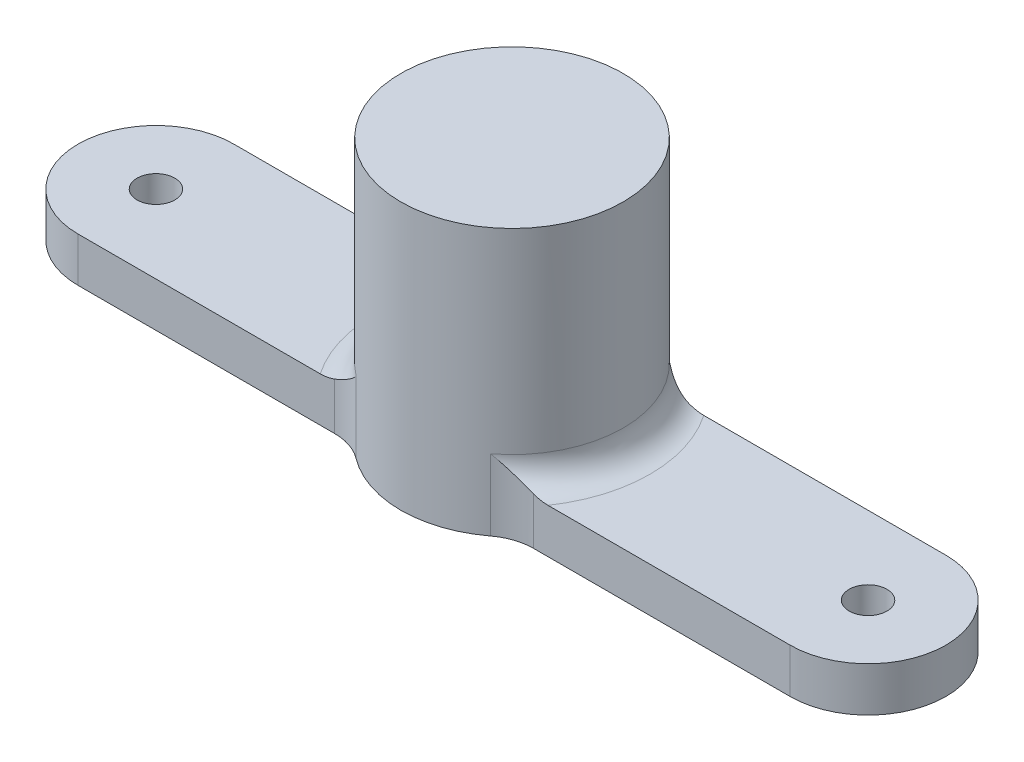
ISO-10303-21;
HEADER;
FILE_DESCRIPTION(('STEP AP214'),'2;1');
FILE_NAME('part.step','',(''),(''),'','','');
FILE_SCHEMA(('AUTOMOTIVE_DESIGN { 1 0 10303 214 1 1 1 1 }'));
ENDSEC;
DATA;
#1=APPLICATION_CONTEXT('core data for automotive mechanical design processes');
#2=APPLICATION_PROTOCOL_DEFINITION('international standard','automotive_design',2000,#1);
#3=PRODUCT_CONTEXT('',#1,'mechanical');
#4=PRODUCT('Part','Part','',(#3));
#5=PRODUCT_RELATED_PRODUCT_CATEGORY('part','',(#4));
#6=PRODUCT_DEFINITION_FORMATION('','',#4);
#7=PRODUCT_DEFINITION_CONTEXT('part definition',#1,'design');
#8=PRODUCT_DEFINITION('design','',#6,#7);
#9=PRODUCT_DEFINITION_SHAPE('','',#8);
#10=(LENGTH_UNIT() NAMED_UNIT(*) SI_UNIT(.MILLI.,.METRE.));
#11=(NAMED_UNIT(*) PLANE_ANGLE_UNIT() SI_UNIT($,.RADIAN.));
#12=(NAMED_UNIT(*) SI_UNIT($,.STERADIAN.) SOLID_ANGLE_UNIT());
#13=UNCERTAINTY_MEASURE_WITH_UNIT(LENGTH_MEASURE(1.E-05),#10,'distance_accuracy_value','');
#14=(GEOMETRIC_REPRESENTATION_CONTEXT(3) GLOBAL_UNCERTAINTY_ASSIGNED_CONTEXT((#13)) GLOBAL_UNIT_ASSIGNED_CONTEXT((#10,
#11,#12)) REPRESENTATION_CONTEXT('',''));
#15=CARTESIAN_POINT('',(0.,0.,0.));
#16=DIRECTION('',(0.,0.,1.));
#17=DIRECTION('',(1.,0.,0.));
#18=AXIS2_PLACEMENT_3D('',#15,#16,#17);
#19=CARTESIAN_POINT('',(-40.,-5.,0.));
#20=DIRECTION('',(0.,-1.,0.));
#21=DIRECTION('',(0.,0.,-1.));
#22=AXIS2_PLACEMENT_3D('',#19,#20,#21);
#23=PLANE('',#22);
#24=CARTESIAN_POINT('',(-40.,-5.,0.));
#25=DIRECTION('',(0.,-1.,0.));
#26=DIRECTION('',(0.,0.,-1.));
#27=AXIS2_PLACEMENT_3D('',#24,#25,#26);
#28=CIRCLE('',#27,8.75);
#29=CARTESIAN_POINT('',(-40.,-5.,8.75));
#30=VERTEX_POINT('',#29);
#31=CARTESIAN_POINT('',(-40.,-5.,-8.75));
#32=VERTEX_POINT('',#31);
#33=EDGE_CURVE('E158',#30,#32,#28,.T.);
#34=ORIENTED_EDGE('',*,*,#33,.T.);
#35=DIRECTION('',(1.,0.,0.));
#36=VECTOR('',#35,1.);
#37=CARTESIAN_POINT('',(-40.,-5.,-8.75));
#38=LINE('',#37,#36);
#39=CARTESIAN_POINT('',(-11.1663557170637,-5.,-8.74999999999999));
#40=VERTEX_POINT('',#39);
#41=EDGE_CURVE('E142',#32,#40,#38,.T.);
#42=ORIENTED_EDGE('',*,*,#41,.T.);
#43=CARTESIAN_POINT('',(-11.1663557170637,-5.,-14.75));
#44=DIRECTION('',(0.,-1.,0.));
#45=DIRECTION('',(0.,0.,-1.));
#46=AXIS2_PLACEMENT_3D('',#43,#44,#45);
#47=CIRCLE('',#46,6.);
#48=CARTESIAN_POINT('',(-7.54483494396193,-5.,-9.96621621621621));
#49=VERTEX_POINT('',#48);
#50=EDGE_CURVE('E273',#40,#49,#47,.F.);
#51=ORIENTED_EDGE('',*,*,#50,.T.);
#52=CARTESIAN_POINT('',(0.,-5.,0.));
#53=DIRECTION('',(0.,-1.,0.));
#54=DIRECTION('',(0.,0.,-1.));
#55=AXIS2_PLACEMENT_3D('',#52,#53,#54);
#56=CIRCLE('',#55,12.5);
#57=CARTESIAN_POINT('',(7.54483494396193,-5.,-9.96621621621621));
#58=VERTEX_POINT('',#57);
#59=EDGE_CURVE('E447',#49,#58,#56,.T.);
#60=ORIENTED_EDGE('',*,*,#59,.T.);
#61=CARTESIAN_POINT('',(11.1663557170637,-5.,-14.75));
#62=DIRECTION('',(0.,-1.,0.));
#63=DIRECTION('',(0.,0.,-1.));
#64=AXIS2_PLACEMENT_3D('',#61,#62,#63);
#65=CIRCLE('',#64,6.);
#66=CARTESIAN_POINT('',(11.1663557170637,-5.,-8.74999999999999));
#67=VERTEX_POINT('',#66);
#68=EDGE_CURVE('E11',#58,#67,#65,.F.);
#69=ORIENTED_EDGE('',*,*,#68,.T.);
#70=CARTESIAN_POINT('',(40.,-5.,-8.74999999999999));
#71=VERTEX_POINT('',#70);
#72=EDGE_CURVE('E155',#67,#71,#38,.T.);
#73=ORIENTED_EDGE('',*,*,#72,.T.);
#74=CARTESIAN_POINT('',(40.,-5.,0.));
#75=DIRECTION('',(0.,-1.,0.));
#76=DIRECTION('',(0.,0.,-1.));
#77=AXIS2_PLACEMENT_3D('',#74,#75,#76);
#78=CIRCLE('',#77,8.75);
#79=CARTESIAN_POINT('',(40.,-5.,8.75000000000001));
#80=VERTEX_POINT('',#79);
#81=EDGE_CURVE('E154',#71,#80,#78,.T.);
#82=ORIENTED_EDGE('',*,*,#81,.T.);
#83=DIRECTION('',(-1.,0.,0.));
#84=VECTOR('',#83,1.);
#85=CARTESIAN_POINT('',(-40.,-5.,8.75));
#86=LINE('',#85,#84);
#87=CARTESIAN_POINT('',(11.1663557170636,-5.,8.75000000000001));
#88=VERTEX_POINT('',#87);
#89=EDGE_CURVE('E326',#80,#88,#86,.T.);
#90=ORIENTED_EDGE('',*,*,#89,.T.);
#91=CARTESIAN_POINT('',(11.1663557170636,-5.,14.75));
#92=DIRECTION('',(0.,-1.,0.));
#93=DIRECTION('',(0.,0.,-1.));
#94=AXIS2_PLACEMENT_3D('',#91,#92,#93);
#95=CIRCLE('',#94,6.);
#96=CARTESIAN_POINT('',(7.54483494396192,-5.,9.96621621621622));
#97=VERTEX_POINT('',#96);
#98=EDGE_CURVE('E240',#88,#97,#95,.F.);
#99=ORIENTED_EDGE('',*,*,#98,.T.);
#100=CARTESIAN_POINT('',(0.,-5.,0.));
#101=DIRECTION('',(0.,-1.,0.));
#102=DIRECTION('',(0.,0.,-1.));
#103=AXIS2_PLACEMENT_3D('',#100,#101,#102);
#104=CIRCLE('',#103,12.5);
#105=CARTESIAN_POINT('',(-7.54483494396192,-5.,9.96621621621622));
#106=VERTEX_POINT('',#105);
#107=EDGE_CURVE('E334',#97,#106,#104,.T.);
#108=ORIENTED_EDGE('',*,*,#107,.T.);
#109=CARTESIAN_POINT('',(-11.1663557170636,-5.,14.75));
#110=DIRECTION('',(0.,-1.,0.));
#111=DIRECTION('',(0.,0.,-1.));
#112=AXIS2_PLACEMENT_3D('',#109,#110,#111);
#113=CIRCLE('',#112,6.);
#114=CARTESIAN_POINT('',(-11.1663557170636,-5.,8.75));
#115=VERTEX_POINT('',#114);
#116=EDGE_CURVE('E263',#106,#115,#113,.F.);
#117=ORIENTED_EDGE('',*,*,#116,.T.);
#118=EDGE_CURVE('E161',#115,#30,#86,.T.);
#119=ORIENTED_EDGE('',*,*,#118,.T.);
#120=EDGE_LOOP('',(#34,#42,#51,#60,#69,#73,#82,#90,#99,#108,#117,#119));
#121=FACE_BOUND('',#120,.T.);
#122=CARTESIAN_POINT('',(-40.,-5.,0.));
#123=DIRECTION('',(0.,-1.,0.));
#124=DIRECTION('',(0.,0.,-1.));
#125=AXIS2_PLACEMENT_3D('',#122,#123,#124);
#126=CIRCLE('',#125,4.15);
#127=CARTESIAN_POINT('',(-40.,-5.,-4.15));
#128=VERTEX_POINT('',#127);
#129=EDGE_CURVE('E435',#128,#128,#126,.T.);
#130=ORIENTED_EDGE('',*,*,#129,.F.);
#131=EDGE_LOOP('',(#130));
#132=FACE_BOUND('',#131,.T.);
#133=CARTESIAN_POINT('',(40.,-5.,0.));
#134=DIRECTION('',(0.,1.,0.));
#135=DIRECTION('',(0.,0.,-1.));
#136=AXIS2_PLACEMENT_3D('',#133,#134,#135);
#137=CIRCLE('',#136,4.15);
#138=CARTESIAN_POINT('',(40.,-5.,-4.15));
#139=VERTEX_POINT('',#138);
#140=EDGE_CURVE('E419',#139,#139,#137,.T.);
#141=ORIENTED_EDGE('',*,*,#140,.T.);
#142=EDGE_LOOP('',(#141));
#143=FACE_BOUND('',#142,.T.);
#144=ADVANCED_FACE('F39',(#121,#132,#143),#23,.T.);
#145=CARTESIAN_POINT('',(40.,-5.,0.));
#146=DIRECTION('',(0.,1.,0.));
#147=DIRECTION('',(0.,0.,1.));
#148=AXIS2_PLACEMENT_3D('',#145,#146,#147);
#149=CYLINDRICAL_SURFACE('',#148,2.125);
#150=CARTESIAN_POINT('',(40.,0.,0.));
#151=DIRECTION('',(0.,-1.,0.));
#152=DIRECTION('',(0.,0.,1.));
#153=AXIS2_PLACEMENT_3D('',#150,#151,#152);
#154=CIRCLE('',#153,2.125);
#155=CARTESIAN_POINT('',(40.,0.,2.125));
#156=VERTEX_POINT('',#155);
#157=EDGE_CURVE('E426',#156,#156,#154,.T.);
#158=ORIENTED_EDGE('',*,*,#157,.F.);
#159=EDGE_LOOP('',(#158));
#160=FACE_BOUND('',#159,.T.);
#161=CARTESIAN_POINT('',(40.,-3.,0.));
#162=DIRECTION('',(0.,1.,0.));
#163=DIRECTION('',(0.,0.,-1.));
#164=AXIS2_PLACEMENT_3D('',#161,#162,#163);
#165=CIRCLE('',#164,2.125);
#166=CARTESIAN_POINT('',(40.,-3.,-2.125));
#167=VERTEX_POINT('',#166);
#168=EDGE_CURVE('E416',#167,#167,#165,.T.);
#169=ORIENTED_EDGE('',*,*,#168,.F.);
#170=EDGE_LOOP('',(#169));
#171=FACE_BOUND('',#170,.T.);
#172=ADVANCED_FACE('F382',(#160,#171),#149,.F.);
#173=CARTESIAN_POINT('',(-40.,-5.,0.));
#174=DIRECTION('',(0.,1.,0.));
#175=DIRECTION('',(0.,0.,1.));
#176=AXIS2_PLACEMENT_3D('',#173,#174,#175);
#177=CYLINDRICAL_SURFACE('',#176,2.125);
#178=CARTESIAN_POINT('',(-40.,0.,0.));
#179=DIRECTION('',(0.,1.,0.));
#180=DIRECTION('',(0.,0.,1.));
#181=AXIS2_PLACEMENT_3D('',#178,#179,#180);
#182=CIRCLE('',#181,2.125);
#183=CARTESIAN_POINT('',(-40.,0.,2.125));
#184=VERTEX_POINT('',#183);
#185=EDGE_CURVE('E440',#184,#184,#182,.T.);
#186=ORIENTED_EDGE('',*,*,#185,.T.);
#187=EDGE_LOOP('',(#186));
#188=FACE_BOUND('',#187,.T.);
#189=CARTESIAN_POINT('',(-40.,-3.,0.));
#190=DIRECTION('',(0.,-1.,0.));
#191=DIRECTION('',(0.,0.,-1.));
#192=AXIS2_PLACEMENT_3D('',#189,#190,#191);
#193=CIRCLE('',#192,2.125);
#194=CARTESIAN_POINT('',(-40.,-3.,-2.125));
#195=VERTEX_POINT('',#194);
#196=EDGE_CURVE('E431',#195,#195,#193,.T.);
#197=ORIENTED_EDGE('',*,*,#196,.T.);
#198=EDGE_LOOP('',(#197));
#199=FACE_BOUND('',#198,.T.);
#200=ADVANCED_FACE('F386',(#188,#199),#177,.F.);
#201=CARTESIAN_POINT('',(-40.,-5.,-8.75));
#202=DIRECTION('',(0.,0.,1.));
#203=DIRECTION('',(1.,0.,0.));
#204=AXIS2_PLACEMENT_3D('',#201,#202,#203);
#205=PLANE('',#204);
#206=ORIENTED_EDGE('',*,*,#72,.F.);
#207=DIRECTION('',(0.,1.,0.));
#208=VECTOR('',#207,1.);
#209=CARTESIAN_POINT('',(11.1663557170637,3.,-8.74999999999999));
#210=LINE('',#209,#208);
#211=CARTESIAN_POINT('',(11.1663557170637,0.302947955184337,-8.74999999999999));
#212=VERTEX_POINT('',#211);
#213=EDGE_CURVE('E241',#67,#212,#210,.T.);
#214=ORIENTED_EDGE('',*,*,#213,.T.);
#215=CARTESIAN_POINT('',(8.92678553567857,3.,-8.74999999999999));
#216=CARTESIAN_POINT('',(8.92675709977544,2.93105381355906,-8.74999999999999));
#217=CARTESIAN_POINT('',(8.93011271661341,2.86212370146082,-8.74999999999999));
#218=CARTESIAN_POINT('',(8.94337216309319,2.72495990012827,-8.74999999999999));
#219=CARTESIAN_POINT('',(8.95326976354844,2.65672561103965,-8.74999999999999));
#220=CARTESIAN_POINT('',(8.97927164827894,2.52211798821309,-8.74999999999999));
#221=CARTESIAN_POINT('',(8.99531690321489,2.45573320774254,-8.74999999999999));
#222=CARTESIAN_POINT('',(9.03323659136617,2.32465953297554,-8.74999999999999));
#223=CARTESIAN_POINT('',(9.05511211058837,2.25997095710044,-8.74999999999999));
#224=CARTESIAN_POINT('',(9.12865743281891,2.06955287954249,-8.74999999999999));
#225=CARTESIAN_POINT('',(9.18837047531509,1.9468580914877,-8.74999999999999));
#226=CARTESIAN_POINT('',(9.32550423537206,1.71164636293119,-8.74999999999999));
#227=CARTESIAN_POINT('',(9.40297192374812,1.59915754486521,-8.74999999999999));
#228=CARTESIAN_POINT('',(9.60904082620121,1.3385884726001,-8.74999999999999));
#229=CARTESIAN_POINT('',(9.74518675499902,1.19646199969491,-8.74999999999999));
#230=CARTESIAN_POINT('',(10.0384782641698,0.935866703487718,-8.74999999999999));
#231=CARTESIAN_POINT('',(10.1956637568866,0.817443938986687,-8.74999999999999));
#232=CARTESIAN_POINT('',(10.5680094314743,0.576502914628001,-8.74999999999999));
#233=CARTESIAN_POINT('',(10.787635066281,0.460882060400057,-8.74999999999999));
#234=CARTESIAN_POINT('',(11.242685312574,0.267261859025457,-8.74999999999999));
#235=CARTESIAN_POINT('',(11.4781074297395,0.189256588095429,-8.74999999999999));
#236=CARTESIAN_POINT('',(11.8942896291995,0.0875177318197846,-8.74999999999999));
#237=CARTESIAN_POINT('',(12.0729160233493,0.0548642826004072,-8.74999999999999));
#238=CARTESIAN_POINT('',(12.4323384479705,0.0111495303683416,-8.74999999999999));
#239=CARTESIAN_POINT('',(12.613128091383,3.55279135432514E-05,-8.74999999999999));
#240=CARTESIAN_POINT('',(12.794041581924,0.,-8.74999999999999));
#241=B_SPLINE_CURVE_WITH_KNOTS('',3,(#215,#216,#217,#218,#219,#220,#221,#222,#223,#224,#225,
#226,#227,#228,#229,#230,#231,#232,#233,#234,#235,#236,#237,#238,#239,#240),.UNSPECIFIED.,.F.,
.F.,(4,2,2,2,2,2,2,2,2,2,2,2,4),(0.,0.206730890611382,0.413265217950678,0.61786419801881,
0.822501315531364,1.22992421912838,1.63843768353364,2.22563659093417,2.81396564172981,
3.55481799475075,4.29555363860848,4.83908306788623,5.38128098482188),.UNSPECIFIED.);
#242=CARTESIAN_POINT('',(12.794041581924,0.,-8.74999999999999));
#243=VERTEX_POINT('',#242);
#244=EDGE_CURVE('E196',#212,#243,#241,.T.);
#245=ORIENTED_EDGE('',*,*,#244,.T.);
#246=DIRECTION('',(1.,0.,0.));
#247=VECTOR('',#246,1.);
#248=CARTESIAN_POINT('',(-40.,0.,-8.75));
#249=LINE('',#248,#247);
#250=CARTESIAN_POINT('',(40.,0.,-8.74999999999999));
#251=VERTEX_POINT('',#250);
#252=EDGE_CURVE('E333',#243,#251,#249,.T.);
#253=ORIENTED_EDGE('',*,*,#252,.T.);
#254=DIRECTION('',(0.,1.,0.));
#255=VECTOR('',#254,1.);
#256=CARTESIAN_POINT('',(40.,-5.,-8.74999999999999));
#257=LINE('',#256,#255);
#258=EDGE_CURVE('E173',#71,#251,#257,.T.);
#259=ORIENTED_EDGE('',*,*,#258,.F.);
#260=EDGE_LOOP('',(#206,#214,#245,#253,#259));
#261=FACE_BOUND('',#260,.T.);
#262=ADVANCED_FACE('F212',(#261),#205,.F.);
#263=CARTESIAN_POINT('',(-12.794041581924,0.,-8.74999999999999));
#264=CARTESIAN_POINT('',(-12.6669332233629,1.74426733753424E-05,-8.74999999999999));
#265=CARTESIAN_POINT('',(-12.5399268782074,0.00550514771197675,-8.74999999999999));
#266=CARTESIAN_POINT('',(-12.2868419797134,0.0271739608788777,-8.74999999999999));
#267=CARTESIAN_POINT('',(-12.1607633200597,0.0433538237332969,-8.74999999999999));
#268=CARTESIAN_POINT('',(-11.7837030025524,0.107777743070165,-8.74999999999999));
#269=CARTESIAN_POINT('',(-11.5351864011508,0.171901536755752,-8.74999999999999));
#270=CARTESIAN_POINT('',(-11.1729361040573,0.298494342729726,-8.74999999999999));
#271=CARTESIAN_POINT('',(-11.0536899036209,0.345897576264697,-8.74999999999999));
#272=CARTESIAN_POINT('',(-10.8197256813501,0.450792565799042,-8.74999999999999));
#273=CARTESIAN_POINT('',(-10.7050079241454,0.508284910312237,-8.74999999999999));
#274=CARTESIAN_POINT('',(-10.3697301405716,0.695620771889401,-8.74999999999999));
#275=CARTESIAN_POINT('',(-10.1571817025444,0.840620232269252,-8.74999999999999));
#276=CARTESIAN_POINT('',(-9.83211102719341,1.11506811283965,-8.74999999999999));
#277=CARTESIAN_POINT('',(-9.71001230792252,1.23330227689205,-8.74999999999999));
#278=CARTESIAN_POINT('',(-9.4856503148351,1.4874000511681,-8.74999999999999));
#279=CARTESIAN_POINT('',(-9.38335854779535,1.62323786067979,-8.74999999999999));
#280=CARTESIAN_POINT('',(-9.22281939324462,1.8825611519249,-8.74999999999999));
#281=CARTESIAN_POINT('',(-9.15985749324515,2.0031186719136,-8.74999999999999));
#282=CARTESIAN_POINT('',(-9.05469372940305,2.25287595798885,-8.74999999999999));
#283=CARTESIAN_POINT('',(-9.01244310087547,2.38205460214189,-8.74999999999999));
#284=CARTESIAN_POINT('',(-8.96396410974828,2.59350030826749,-8.74999999999999));
#285=CARTESIAN_POINT('',(-8.95009550453669,2.67406527831177,-8.74999999999999));
#286=CARTESIAN_POINT('',(-8.93147596638544,2.836396595244,-8.74999999999999));
#287=CARTESIAN_POINT('',(-8.9267429121389,2.91816498296398,-8.74999999999999));
#288=CARTESIAN_POINT('',(-8.92678553567857,3.,-8.74999999999999));
#289=B_SPLINE_CURVE_WITH_KNOTS('',3,(#263,#264,#265,#266,#267,#268,#269,#270,#271,#272,#273,
#274,#275,#276,#277,#278,#279,#280,#281,#282,#283,#284,#285,#286,#287,#288),.UNSPECIFIED.,.F.,
.F.,(4,2,2,2,2,2,2,2,2,2,2,2,4),(0.,0.381015064313975,0.761985761109777,1.52774931974878,
1.91232387540066,2.29692087135663,3.0634089120755,3.57170698213769,4.0792683190092,
4.48574271139359,4.89125540726969,5.13602564418862,5.38127442393823),.UNSPECIFIED.);
#290=CARTESIAN_POINT('',(-12.794041581924,0.,-8.74999999999999));
#291=VERTEX_POINT('',#290);
#292=CARTESIAN_POINT('',(-11.1663557170637,0.302947955184335,-8.74999999999999));
#293=VERTEX_POINT('',#292);
#294=EDGE_CURVE('E289',#291,#293,#289,.T.);
#295=ORIENTED_EDGE('',*,*,#294,.T.);
#296=DIRECTION('',(0.,1.,0.));
#297=VECTOR('',#296,1.);
#298=CARTESIAN_POINT('',(-11.1663557170637,-5.,-8.74999999999999));
#299=LINE('',#298,#297);
#300=EDGE_CURVE('E151',#293,#40,#299,.F.);
#301=ORIENTED_EDGE('',*,*,#300,.T.);
#302=ORIENTED_EDGE('',*,*,#41,.F.);
#303=DIRECTION('',(0.,1.,0.));
#304=VECTOR('',#303,1.);
#305=CARTESIAN_POINT('',(-40.,-5.,-8.75));
#306=LINE('',#305,#304);
#307=CARTESIAN_POINT('',(-40.,0.,-8.75));
#308=VERTEX_POINT('',#307);
#309=EDGE_CURVE('E148',#32,#308,#306,.T.);
#310=ORIENTED_EDGE('',*,*,#309,.T.);
#311=EDGE_CURVE('E335',#308,#291,#249,.T.);
#312=ORIENTED_EDGE('',*,*,#311,.T.);
#313=EDGE_LOOP('',(#295,#301,#302,#310,#312));
#314=FACE_BOUND('',#313,.T.);
#315=ADVANCED_FACE('F145',(#314),#205,.F.);
#316=CARTESIAN_POINT('',(-40.,-5.,8.75));
#317=DIRECTION('',(0.,0.,-1.));
#318=DIRECTION('',(-1.,0.,0.));
#319=AXIS2_PLACEMENT_3D('',#316,#317,#318);
#320=PLANE('',#319);
#321=ORIENTED_EDGE('',*,*,#118,.F.);
#322=DIRECTION('',(0.,1.,0.));
#323=VECTOR('',#322,1.);
#324=CARTESIAN_POINT('',(-11.1663557170636,3.,8.75));
#325=LINE('',#324,#323);
#326=CARTESIAN_POINT('',(-11.1663557170636,0.302947955184338,8.75));
#327=VERTEX_POINT('',#326);
#328=EDGE_CURVE('E312',#115,#327,#325,.T.);
#329=ORIENTED_EDGE('',*,*,#328,.T.);
#330=CARTESIAN_POINT('',(-8.92678553567856,3.,8.75));
#331=CARTESIAN_POINT('',(-8.92675709977543,2.93105381355906,8.75));
#332=CARTESIAN_POINT('',(-8.9301127166134,2.86212370146082,8.75));
#333=CARTESIAN_POINT('',(-8.94337216309318,2.72495990012826,8.75));
#334=CARTESIAN_POINT('',(-8.95326976354842,2.65672561103965,8.75));
#335=CARTESIAN_POINT('',(-8.97927164827892,2.52211798821309,8.75));
#336=CARTESIAN_POINT('',(-8.99531690321487,2.45573320774254,8.75));
#337=CARTESIAN_POINT('',(-9.03323659136615,2.32465953297554,8.75));
#338=CARTESIAN_POINT('',(-9.05511211058836,2.25997095710045,8.75));
#339=CARTESIAN_POINT('',(-9.1286574328189,2.06955287954249,8.75));
#340=CARTESIAN_POINT('',(-9.18837047531508,1.94685809148771,8.75));
#341=CARTESIAN_POINT('',(-9.32550423537205,1.71164636293119,8.75));
#342=CARTESIAN_POINT('',(-9.4029719237481,1.59915754486521,8.75));
#343=CARTESIAN_POINT('',(-9.60904082620119,1.3385884726001,8.75));
#344=CARTESIAN_POINT('',(-9.74518675499901,1.19646199969492,8.75));
#345=CARTESIAN_POINT('',(-10.0384782641698,0.93586670348772,8.75));
#346=CARTESIAN_POINT('',(-10.1956637568866,0.817443938986691,8.75));
#347=CARTESIAN_POINT('',(-10.5680094314743,0.576502914628005,8.75));
#348=CARTESIAN_POINT('',(-10.787635066281,0.460882060400059,8.75));
#349=CARTESIAN_POINT('',(-11.242685312574,0.267261859025457,8.75));
#350=CARTESIAN_POINT('',(-11.4781074297395,0.189256588095431,8.75));
#351=CARTESIAN_POINT('',(-11.8942896291995,0.087517731819786,8.75));
#352=CARTESIAN_POINT('',(-12.0729160233493,0.0548642826004076,8.75));
#353=CARTESIAN_POINT('',(-12.4323384479705,0.0111495303683408,8.75));
#354=CARTESIAN_POINT('',(-12.613128091383,3.55279135421043E-05,8.75));
#355=CARTESIAN_POINT('',(-12.794041581924,0.,8.75));
#356=B_SPLINE_CURVE_WITH_KNOTS('',3,(#330,#331,#332,#333,#334,#335,#336,#337,#338,#339,#340,
#341,#342,#343,#344,#345,#346,#347,#348,#349,#350,#351,#352,#353,#354,#355),.UNSPECIFIED.,.F.,
.F.,(4,2,2,2,2,2,2,2,2,2,2,2,4),(0.,0.206730890611382,0.413265217950678,0.617864198018809,
0.822501315531363,1.22992421912837,1.63843768353364,2.22563659093416,2.81396564172981,
3.55481799475074,4.29555363860849,4.83908306788624,5.38128098482188),.UNSPECIFIED.);
#357=CARTESIAN_POINT('',(-12.794041581924,0.,8.75));
#358=VERTEX_POINT('',#357);
#359=EDGE_CURVE('E296',#327,#358,#356,.T.);
#360=ORIENTED_EDGE('',*,*,#359,.T.);
#361=DIRECTION('',(-1.,0.,0.));
#362=VECTOR('',#361,1.);
#363=CARTESIAN_POINT('',(-40.,0.,8.75));
#364=LINE('',#363,#362);
#365=CARTESIAN_POINT('',(-40.,0.,8.75));
#366=VERTEX_POINT('',#365);
#367=EDGE_CURVE('E341',#358,#366,#364,.T.);
#368=ORIENTED_EDGE('',*,*,#367,.T.);
#369=DIRECTION('',(0.,1.,0.));
#370=VECTOR('',#369,1.);
#371=CARTESIAN_POINT('',(-40.,-5.,8.75));
#372=LINE('',#371,#370);
#373=EDGE_CURVE('E330',#30,#366,#372,.T.);
#374=ORIENTED_EDGE('',*,*,#373,.F.);
#375=EDGE_LOOP('',(#321,#329,#360,#368,#374));
#376=FACE_BOUND('',#375,.T.);
#377=ADVANCED_FACE('F368',(#376),#320,.F.);
#378=CARTESIAN_POINT('',(12.794041581924,0.,8.75000000000001));
#379=CARTESIAN_POINT('',(12.6669332233629,1.74426733759981E-05,8.75000000000001));
#380=CARTESIAN_POINT('',(12.5399268782074,0.00550514771197745,8.75000000000001));
#381=CARTESIAN_POINT('',(12.2868419797134,0.0271739608788781,8.75000000000001));
#382=CARTESIAN_POINT('',(12.1607633200597,0.043353823733297,8.75000000000001));
#383=CARTESIAN_POINT('',(11.7837030025524,0.107777743070165,8.75000000000001));
#384=CARTESIAN_POINT('',(11.5351864011508,0.171901536755753,8.75000000000001));
#385=CARTESIAN_POINT('',(11.1729361040573,0.298494342729727,8.75000000000001));
#386=CARTESIAN_POINT('',(11.0536899036209,0.345897576264697,8.75000000000001));
#387=CARTESIAN_POINT('',(10.8197256813501,0.450792565799041,8.75000000000001));
#388=CARTESIAN_POINT('',(10.7050079241453,0.508284910312237,8.75000000000001));
#389=CARTESIAN_POINT('',(10.3697301405715,0.695620771889401,8.75000000000001));
#390=CARTESIAN_POINT('',(10.1571817025444,0.840620232269253,8.75000000000001));
#391=CARTESIAN_POINT('',(9.8321110271934,1.11506811283965,8.75000000000001));
#392=CARTESIAN_POINT('',(9.71001230792251,1.23330227689205,8.75000000000001));
#393=CARTESIAN_POINT('',(9.48565031483509,1.48740005116809,8.75000000000001));
#394=CARTESIAN_POINT('',(9.38335854779534,1.62323786067979,8.75000000000001));
#395=CARTESIAN_POINT('',(9.22281939324461,1.8825611519249,8.75000000000001));
#396=CARTESIAN_POINT('',(9.15985749324514,2.0031186719136,8.75000000000001));
#397=CARTESIAN_POINT('',(9.05469372940304,2.25287595798885,8.75000000000001));
#398=CARTESIAN_POINT('',(9.01244310087545,2.38205460214188,8.75000000000001));
#399=CARTESIAN_POINT('',(8.96396410974826,2.59350030826749,8.75000000000001));
#400=CARTESIAN_POINT('',(8.95009550453668,2.67406527831176,8.75000000000001));
#401=CARTESIAN_POINT('',(8.93147596638543,2.836396595244,8.75000000000001));
#402=CARTESIAN_POINT('',(8.92674291213889,2.91816498296398,8.75000000000001));
#403=CARTESIAN_POINT('',(8.92678553567856,3.,8.75000000000001));
#404=B_SPLINE_CURVE_WITH_KNOTS('',3,(#378,#379,#380,#381,#382,#383,#384,#385,#386,#387,#388,
#389,#390,#391,#392,#393,#394,#395,#396,#397,#398,#399,#400,#401,#402,#403),.UNSPECIFIED.,.F.,
.F.,(4,2,2,2,2,2,2,2,2,2,2,2,4),(0.,0.381015064313977,0.761985761109777,1.52774931974878,
1.91232387540066,2.29692087135663,3.0634089120755,3.57170698213769,4.07926831900921,
4.48574271139359,4.89125540726969,5.13602564418862,5.38127442393823),.UNSPECIFIED.);
#405=CARTESIAN_POINT('',(12.794041581924,0.,8.75000000000001));
#406=VERTEX_POINT('',#405);
#407=CARTESIAN_POINT('',(11.1663557170636,0.302947955184338,8.75000000000001));
#408=VERTEX_POINT('',#407);
#409=EDGE_CURVE('E205',#406,#408,#404,.T.);
#410=ORIENTED_EDGE('',*,*,#409,.T.);
#411=DIRECTION('',(0.,1.,0.));
#412=VECTOR('',#411,1.);
#413=CARTESIAN_POINT('',(11.1663557170636,-5.,8.75000000000001));
#414=LINE('',#413,#412);
#415=EDGE_CURVE('E309',#408,#88,#414,.F.);
#416=ORIENTED_EDGE('',*,*,#415,.T.);
#417=ORIENTED_EDGE('',*,*,#89,.F.);
#418=DIRECTION('',(0.,1.,0.));
#419=VECTOR('',#418,1.);
#420=CARTESIAN_POINT('',(40.,-5.,8.75000000000001));
#421=LINE('',#420,#419);
#422=CARTESIAN_POINT('',(40.,0.,8.75000000000001));
#423=VERTEX_POINT('',#422);
#424=EDGE_CURVE('E181',#80,#423,#421,.T.);
#425=ORIENTED_EDGE('',*,*,#424,.T.);
#426=EDGE_CURVE('E166',#423,#406,#364,.T.);
#427=ORIENTED_EDGE('',*,*,#426,.T.);
#428=EDGE_LOOP('',(#410,#416,#417,#425,#427));
#429=FACE_BOUND('',#428,.T.);
#430=ADVANCED_FACE('F353',(#429),#320,.F.);
#431=CARTESIAN_POINT('',(0.,25.,0.));
#432=DIRECTION('',(0.,-1.,0.));
#433=DIRECTION('',(0.,0.,-1.));
#434=AXIS2_PLACEMENT_3D('',#431,#432,#433);
#435=CYLINDRICAL_SURFACE('',#434,12.5);
#436=CARTESIAN_POINT('',(0.,25.,0.));
#437=DIRECTION('',(0.,1.,0.));
#438=DIRECTION('',(0.,0.,1.));
#439=AXIS2_PLACEMENT_3D('',#436,#437,#438);
#440=CIRCLE('',#439,12.5);
#441=CARTESIAN_POINT('',(0.,25.,12.5));
#442=VERTEX_POINT('',#441);
#443=EDGE_CURVE('E172',#442,#442,#440,.T.);
#444=ORIENTED_EDGE('',*,*,#443,.F.);
#445=EDGE_LOOP('',(#444));
#446=FACE_BOUND('',#445,.T.);
#447=ORIENTED_EDGE('',*,*,#107,.F.);
#448=DIRECTION('',(0.,-1.,0.));
#449=VECTOR('',#448,1.);
#450=CARTESIAN_POINT('',(7.54483494396192,25.,9.96621621621622));
#451=LINE('',#450,#449);
#452=CARTESIAN_POINT('',(7.54483494396192,3.,9.96621621621622));
#453=VERTEX_POINT('',#452);
#454=EDGE_CURVE('E305',#97,#453,#451,.F.);
#455=ORIENTED_EDGE('',*,*,#454,.T.);
#456=CARTESIAN_POINT('',(0.,3.,0.));
#457=DIRECTION('',(0.,-1.,0.));
#458=DIRECTION('',(0.,0.,-1.));
#459=AXIS2_PLACEMENT_3D('',#456,#457,#458);
#460=CIRCLE('',#459,12.5);
#461=CARTESIAN_POINT('',(7.54483494396193,3.,-9.96621621621621));
#462=VERTEX_POINT('',#461);
#463=EDGE_CURVE('E187',#453,#462,#460,.F.);
#464=ORIENTED_EDGE('',*,*,#463,.T.);
#465=DIRECTION('',(0.,-1.,0.));
#466=VECTOR('',#465,1.);
#467=CARTESIAN_POINT('',(7.54483494396194,25.,-9.96621621621621));
#468=LINE('',#467,#466);
#469=EDGE_CURVE('E284',#462,#58,#468,.T.);
#470=ORIENTED_EDGE('',*,*,#469,.T.);
#471=ORIENTED_EDGE('',*,*,#59,.F.);
#472=DIRECTION('',(0.,-1.,0.));
#473=VECTOR('',#472,1.);
#474=CARTESIAN_POINT('',(-7.54483494396193,25.,-9.96621621621621));
#475=LINE('',#474,#473);
#476=CARTESIAN_POINT('',(-7.54483494396193,3.,-9.96621621621621));
#477=VERTEX_POINT('',#476);
#478=EDGE_CURVE('E288',#49,#477,#475,.F.);
#479=ORIENTED_EDGE('',*,*,#478,.T.);
#480=CARTESIAN_POINT('',(0.,3.,0.));
#481=DIRECTION('',(0.,-1.,0.));
#482=DIRECTION('',(0.,0.,-1.));
#483=AXIS2_PLACEMENT_3D('',#480,#481,#482);
#484=CIRCLE('',#483,12.5);
#485=CARTESIAN_POINT('',(-7.54483494396192,3.,9.96621621621622));
#486=VERTEX_POINT('',#485);
#487=EDGE_CURVE('E178',#477,#486,#484,.F.);
#488=ORIENTED_EDGE('',*,*,#487,.T.);
#489=DIRECTION('',(0.,-1.,0.));
#490=VECTOR('',#489,1.);
#491=CARTESIAN_POINT('',(-7.54483494396192,25.,9.96621621621622));
#492=LINE('',#491,#490);
#493=EDGE_CURVE('E294',#486,#106,#492,.T.);
#494=ORIENTED_EDGE('',*,*,#493,.T.);
#495=EDGE_LOOP('',(#447,#455,#464,#470,#471,#479,#488,#494));
#496=FACE_BOUND('',#495,.T.);
#497=ADVANCED_FACE('F224',(#446,#496),#435,.T.);
#498=CARTESIAN_POINT('',(0.,25.,0.));
#499=DIRECTION('',(0.,1.,0.));
#500=DIRECTION('',(0.,0.,1.));
#501=AXIS2_PLACEMENT_3D('',#498,#499,#500);
#502=PLANE('',#501);
#503=ORIENTED_EDGE('',*,*,#443,.T.);
#504=EDGE_LOOP('',(#503));
#505=FACE_BOUND('',#504,.T.);
#506=ADVANCED_FACE('F465',(#505),#502,.T.);
#507=CARTESIAN_POINT('',(-40.,0.,0.));
#508=DIRECTION('',(0.,-1.,0.));
#509=DIRECTION('',(0.,0.,-1.));
#510=AXIS2_PLACEMENT_3D('',#507,#508,#509);
#511=PLANE('',#510);
#512=ORIENTED_EDGE('',*,*,#157,.T.);
#513=EDGE_LOOP('',(#512));
#514=FACE_BOUND('',#513,.T.);
#515=ORIENTED_EDGE('',*,*,#252,.F.);
#516=CARTESIAN_POINT('',(0.,0.,0.));
#517=DIRECTION('',(0.,-1.,0.));
#518=DIRECTION('',(0.,0.,-1.));
#519=AXIS2_PLACEMENT_3D('',#516,#517,#518);
#520=CIRCLE('',#519,15.5);
#521=EDGE_CURVE('E190',#243,#406,#520,.T.);
#522=ORIENTED_EDGE('',*,*,#521,.T.);
#523=ORIENTED_EDGE('',*,*,#426,.F.);
#524=CARTESIAN_POINT('',(40.,0.,0.));
#525=DIRECTION('',(0.,-1.,0.));
#526=DIRECTION('',(0.,0.,-1.));
#527=AXIS2_PLACEMENT_3D('',#524,#525,#526);
#528=CIRCLE('',#527,8.75);
#529=EDGE_CURVE('E338',#251,#423,#528,.T.);
#530=ORIENTED_EDGE('',*,*,#529,.F.);
#531=EDGE_LOOP('',(#515,#522,#523,#530));
#532=FACE_BOUND('',#531,.T.);
#533=ADVANCED_FACE('F357',(#514,#532),#511,.F.);
#534=CARTESIAN_POINT('',(-40.,-5.,0.));
#535=DIRECTION('',(0.,1.,0.));
#536=DIRECTION('',(0.,0.,1.));
#537=AXIS2_PLACEMENT_3D('',#534,#535,#536);
#538=CYLINDRICAL_SURFACE('',#537,8.75);
#539=CARTESIAN_POINT('',(-40.,0.,0.));
#540=DIRECTION('',(0.,-1.,0.));
#541=DIRECTION('',(0.,0.,-1.));
#542=AXIS2_PLACEMENT_3D('',#539,#540,#541);
#543=CIRCLE('',#542,8.75);
#544=EDGE_CURVE('E170',#366,#308,#543,.T.);
#545=ORIENTED_EDGE('',*,*,#544,.T.);
#546=ORIENTED_EDGE('',*,*,#309,.F.);
#547=ORIENTED_EDGE('',*,*,#33,.F.);
#548=ORIENTED_EDGE('',*,*,#373,.T.);
#549=EDGE_LOOP('',(#545,#546,#547,#548));
#550=FACE_BOUND('',#549,.T.);
#551=ADVANCED_FACE('F168',(#550),#538,.T.);
#552=CARTESIAN_POINT('',(40.,-5.,0.));
#553=DIRECTION('',(0.,1.,0.));
#554=DIRECTION('',(0.,0.,1.));
#555=AXIS2_PLACEMENT_3D('',#552,#553,#554);
#556=CYLINDRICAL_SURFACE('',#555,8.75);
#557=ORIENTED_EDGE('',*,*,#529,.T.);
#558=ORIENTED_EDGE('',*,*,#424,.F.);
#559=ORIENTED_EDGE('',*,*,#81,.F.);
#560=ORIENTED_EDGE('',*,*,#258,.T.);
#561=EDGE_LOOP('',(#557,#558,#559,#560));
#562=FACE_BOUND('',#561,.T.);
#563=ADVANCED_FACE('F373',(#562),#556,.T.);
#564=ORIENTED_EDGE('',*,*,#185,.F.);
#565=EDGE_LOOP('',(#564));
#566=FACE_BOUND('',#565,.T.);
#567=ORIENTED_EDGE('',*,*,#367,.F.);
#568=CARTESIAN_POINT('',(0.,0.,0.));
#569=DIRECTION('',(0.,-1.,0.));
#570=DIRECTION('',(0.,0.,-1.));
#571=AXIS2_PLACEMENT_3D('',#568,#569,#570);
#572=CIRCLE('',#571,15.5);
#573=EDGE_CURVE('E193',#358,#291,#572,.T.);
#574=ORIENTED_EDGE('',*,*,#573,.T.);
#575=ORIENTED_EDGE('',*,*,#311,.F.);
#576=ORIENTED_EDGE('',*,*,#544,.F.);
#577=EDGE_LOOP('',(#567,#574,#575,#576));
#578=FACE_BOUND('',#577,.T.);
#579=ADVANCED_FACE('F222',(#566,#578),#511,.F.);
#580=CARTESIAN_POINT('',(0.,3.,0.));
#581=DIRECTION('',(0.,-1.,0.));
#582=DIRECTION('',(0.,0.,-1.));
#583=AXIS2_PLACEMENT_3D('',#580,#581,#582);
#584=TOROIDAL_SURFACE('',#583,15.5,3.);
#585=ORIENTED_EDGE('',*,*,#409,.F.);
#586=ORIENTED_EDGE('',*,*,#521,.F.);
#587=ORIENTED_EDGE('',*,*,#244,.F.);
#588=CARTESIAN_POINT('',(11.1663557170637,0.302947955184337,-8.74999999999999));
#589=CARTESIAN_POINT('',(11.0473293663939,0.348600678908912,-8.75000344318039));
#590=CARTESIAN_POINT('',(10.9299536774777,0.39828389837485,-8.75354123233579));
#591=CARTESIAN_POINT('',(10.6989174607542,0.504449093411838,-8.76711784868784));
#592=CARTESIAN_POINT('',(10.5852512901636,0.560920065852088,-8.77714626710253));
#593=CARTESIAN_POINT('',(10.362314209037,0.67920803238191,-8.80306467702727));
#594=CARTESIAN_POINT('',(10.2530216261311,0.740992112856609,-8.81892032707871));
#595=CARTESIAN_POINT('',(10.0381233310867,0.869272617507561,-8.85602126622133));
#596=CARTESIAN_POINT('',(9.93251970161742,0.935771641407029,-8.87726954561554));
#597=CARTESIAN_POINT('',(9.6458521405417,1.1248457988005,-8.94282343693255));
#598=CARTESIAN_POINT('',(9.46865965267567,1.25151002452284,-8.99235514676558));
#599=CARTESIAN_POINT('',(9.12514716140195,1.51328672199708,-9.10498760729196));
#600=CARTESIAN_POINT('',(8.95883400482887,1.6484044112096,-9.16809679775623));
#601=CARTESIAN_POINT('',(8.63595389704336,1.92467483475008,-9.30683717944243));
#602=CARTESIAN_POINT('',(8.47941525188994,2.06584326574322,-9.38250260998973));
#603=CARTESIAN_POINT('',(8.17594649948449,2.35154653309196,-9.54547295819175));
#604=CARTESIAN_POINT('',(8.02901135555927,2.49607955002188,-9.63277170040856));
#605=CARTESIAN_POINT('',(7.82945930128502,2.69959052385206,-9.76304038035738));
#606=CARTESIAN_POINT('',(7.77305738112338,2.75796687382333,-9.80124693310822));
#607=CARTESIAN_POINT('',(7.66171677661084,2.87479420309579,-9.87946280070169));
#608=CARTESIAN_POINT('',(7.60677683849756,2.93324507023971,-9.91947048609498));
#609=CARTESIAN_POINT('',(7.54996782263732,2.99446364075695,-9.96233366480872));
#610=CARTESIAN_POINT('',(7.54740059890964,2.99723182429647,-9.96427391177883));
#611=CARTESIAN_POINT('',(7.54483494396193,3.,-9.96621621621621));
#612=B_SPLINE_CURVE_WITH_KNOTS('',3,(#588,#589,#590,#591,#592,#593,#594,#595,#596,#597,#598,
#599,#600,#601,#602,#603,#604,#605,#606,#607,#608,#609,#610,#611),.UNSPECIFIED.,.F.,.F.,(4,2,2,
2,2,2,2,2,2,2,2,4),(0.,0.382178458420525,0.763745544900533,1.14309909683432,1.52266346802744,
2.19169584051521,2.86114529175854,3.53245118667662,4.20340213405495,4.47252626757993,
4.74141163913447,4.75414593230211),.UNSPECIFIED.);
#613=EDGE_CURVE('E49',#212,#462,#612,.T.);
#614=ORIENTED_EDGE('',*,*,#613,.T.);
#615=ORIENTED_EDGE('',*,*,#463,.F.);
#616=CARTESIAN_POINT('',(11.1663557170636,0.302947955184338,8.75000000000001));
#617=CARTESIAN_POINT('',(11.0473293663939,0.348600678908913,8.75000344318041));
#618=CARTESIAN_POINT('',(10.9299536774776,0.398283898374851,8.75354123233581));
#619=CARTESIAN_POINT('',(10.6989174607542,0.504449093411839,8.76711784868786));
#620=CARTESIAN_POINT('',(10.5852512901635,0.56092006585209,8.77714626710254));
#621=CARTESIAN_POINT('',(10.362314209037,0.679208032381911,8.80306467702729));
#622=CARTESIAN_POINT('',(10.2530216261311,0.740992112856609,8.81892032707873));
#623=CARTESIAN_POINT('',(10.0381233310866,0.869272617507564,8.85602126622135));
#624=CARTESIAN_POINT('',(9.93251970161741,0.935771641407034,8.87726954561556));
#625=CARTESIAN_POINT('',(9.64585214054169,1.12484579880051,8.94282343693257));
#626=CARTESIAN_POINT('',(9.46865965267565,1.25151002452284,8.9923551467656));
#627=CARTESIAN_POINT('',(9.12514716140193,1.51328672199708,9.10498760729198));
#628=CARTESIAN_POINT('',(8.95883400482885,1.6484044112096,9.16809679775625));
#629=CARTESIAN_POINT('',(8.63595389704334,1.92467483475008,9.30683717944245));
#630=CARTESIAN_POINT('',(8.47941525188992,2.06584326574322,9.38250260998975));
#631=CARTESIAN_POINT('',(8.17594649948448,2.35154653309198,9.54547295819176));
#632=CARTESIAN_POINT('',(8.02901135555927,2.49607955002193,9.63277170040855));
#633=CARTESIAN_POINT('',(7.82945930128499,2.69959052385206,9.7630403803574));
#634=CARTESIAN_POINT('',(7.77305738112334,2.75796687382331,9.80124693310825));
#635=CARTESIAN_POINT('',(7.66171677661082,2.87479420309579,9.8794628007017));
#636=CARTESIAN_POINT('',(7.60677683849757,2.93324507023975,9.91947048609497));
#637=CARTESIAN_POINT('',(7.54996782263731,2.99446364075695,9.96233366480873));
#638=CARTESIAN_POINT('',(7.54740059890963,2.99723182429647,9.96427391177884));
#639=CARTESIAN_POINT('',(7.54483494396192,3.,9.96621621621622));
#640=B_SPLINE_CURVE_WITH_KNOTS('',3,(#616,#617,#618,#619,#620,#621,#622,#623,#624,#625,#626,
#627,#628,#629,#630,#631,#632,#633,#634,#635,#636,#637,#638,#639),.UNSPECIFIED.,.F.,.F.,(4,2,2,
2,2,2,2,2,2,2,2,4),(0.,0.382178458420523,0.76374554490053,1.14309909683432,1.52266346802744,
2.19169584051522,2.86114529175854,3.53245118667662,4.20340213405496,4.47252626757992,
4.74141163913447,4.7541459323021),.UNSPECIFIED.);
#641=EDGE_CURVE('E232',#453,#408,#640,.F.);
#642=ORIENTED_EDGE('',*,*,#641,.T.);
#643=EDGE_LOOP('',(#585,#586,#587,#614,#615,#642));
#644=FACE_BOUND('',#643,.T.);
#645=ADVANCED_FACE('F216',(#644),#584,.F.);
#646=CARTESIAN_POINT('',(0.,3.,0.));
#647=DIRECTION('',(0.,-1.,0.));
#648=DIRECTION('',(0.,0.,-1.));
#649=AXIS2_PLACEMENT_3D('',#646,#647,#648);
#650=TOROIDAL_SURFACE('',#649,15.5,3.);
#651=ORIENTED_EDGE('',*,*,#294,.F.);
#652=ORIENTED_EDGE('',*,*,#573,.F.);
#653=ORIENTED_EDGE('',*,*,#359,.F.);
#654=CARTESIAN_POINT('',(-11.1663557170636,0.302947955184338,8.75));
#655=CARTESIAN_POINT('',(-11.0473293663939,0.348600678908897,8.75000344318041));
#656=CARTESIAN_POINT('',(-10.9299536774777,0.398283898374813,8.7535412323358));
#657=CARTESIAN_POINT('',(-10.6989174607544,0.504449093411753,8.76711784868784));
#658=CARTESIAN_POINT('',(-10.5852512901638,0.560920065851976,8.77714626710252));
#659=CARTESIAN_POINT('',(-10.3623142090372,0.679208032381788,8.80306467702725));
#660=CARTESIAN_POINT('',(-10.2530216261313,0.740992112856508,8.8189203270787));
#661=CARTESIAN_POINT('',(-10.0381233310867,0.86927261750751,8.85602126622133));
#662=CARTESIAN_POINT('',(-9.93251970161745,0.935771641407006,8.87726954561554));
#663=CARTESIAN_POINT('',(-9.64585214054166,1.12484579880052,8.94282343693257));
#664=CARTESIAN_POINT('',(-9.4686596526756,1.25151002452287,8.99235514676562));
#665=CARTESIAN_POINT('',(-9.12514716140185,1.51328672199716,9.104987607292));
#666=CARTESIAN_POINT('',(-8.95883400482877,1.64840441120973,9.16809679775627));
#667=CARTESIAN_POINT('',(-8.63595389704322,1.92467483475013,9.30683717944251));
#668=CARTESIAN_POINT('',(-8.47941525188975,2.06584326574316,9.38250260998986));
#669=CARTESIAN_POINT('',(-8.17594649948454,2.35154653309215,9.54547295819171));
#670=CARTESIAN_POINT('',(-8.0290113555596,2.49607955002245,9.6327717004083));
#671=CARTESIAN_POINT('',(-7.82945930128486,2.69959052385187,9.7630403803575));
#672=CARTESIAN_POINT('',(-7.77305738112298,2.75796687382278,9.80124693310853));
#673=CARTESIAN_POINT('',(-7.66171677661121,2.87479420309636,9.8794628007014));
#674=CARTESIAN_POINT('',(-7.60677683849895,2.93324507024176,9.91947048609391));
#675=CARTESIAN_POINT('',(-7.54996782263744,2.99446364075714,9.96233366480863));
#676=CARTESIAN_POINT('',(-7.5474005989097,2.99723182429657,9.96427391177879));
#677=CARTESIAN_POINT('',(-7.54483494396192,3.,9.96621621621622));
#678=B_SPLINE_CURVE_WITH_KNOTS('',3,(#654,#655,#656,#657,#658,#659,#660,#661,#662,#663,#664,
#665,#666,#667,#668,#669,#670,#671,#672,#673,#674,#675,#676,#677),.UNSPECIFIED.,.F.,.F.,(4,2,2,
2,2,2,2,2,2,2,2,4),(0.,0.382178458420373,0.763745544900219,1.14309909683416,1.52266346802744,
2.19169584051531,2.8611452917587,3.5324511866767,4.20340213405496,4.47252626757992,
4.74141163913446,4.75414593230209),.UNSPECIFIED.);
#679=EDGE_CURVE('E255',#327,#486,#678,.T.);
#680=ORIENTED_EDGE('',*,*,#679,.T.);
#681=ORIENTED_EDGE('',*,*,#487,.F.);
#682=CARTESIAN_POINT('',(-11.1663557170637,0.302947955184335,-8.74999999999999));
#683=CARTESIAN_POINT('',(-11.0473293663939,0.348600678908897,-8.7500034431804));
#684=CARTESIAN_POINT('',(-10.9299536774777,0.39828389837482,-8.75354123233579));
#685=CARTESIAN_POINT('',(-10.6989174607543,0.504449093411775,-8.76711784868783));
#686=CARTESIAN_POINT('',(-10.5852512901637,0.560920065852007,-8.77714626710251));
#687=CARTESIAN_POINT('',(-10.3623142090372,0.679208032381821,-8.80306467702725));
#688=CARTESIAN_POINT('',(-10.2530216261312,0.740992112856534,-8.8189203270787));
#689=CARTESIAN_POINT('',(-10.0381233310867,0.869272617507521,-8.85602126622133));
#690=CARTESIAN_POINT('',(-9.93251970161745,0.93577164140701,-8.87726954561554));
#691=CARTESIAN_POINT('',(-9.64585214054168,1.12484579880051,-8.94282343693256));
#692=CARTESIAN_POINT('',(-9.46865965267563,1.25151002452286,-8.9923551467656));
#693=CARTESIAN_POINT('',(-9.12514716140189,1.51328672199713,-9.10498760729199));
#694=CARTESIAN_POINT('',(-8.95883400482881,1.64840441120968,-9.16809679775625));
#695=CARTESIAN_POINT('',(-8.63595389704327,1.92467483475011,-9.30683717944248));
#696=CARTESIAN_POINT('',(-8.47941525188982,2.06584326574318,-9.38250260998981));
#697=CARTESIAN_POINT('',(-8.17594649948453,2.35154653309208,-9.54547295819171));
#698=CARTESIAN_POINT('',(-8.0290113555595,2.49607955002225,-9.63277170040838));
#699=CARTESIAN_POINT('',(-7.82945930128491,2.69959052385191,-9.76304038035746));
#700=CARTESIAN_POINT('',(-7.7730573811231,2.75796687382293,-9.80124693310843));
#701=CARTESIAN_POINT('',(-7.66171677661109,2.87479420309616,-9.8794628007015));
#702=CARTESIAN_POINT('',(-7.60677683849851,2.93324507024108,-9.91947048609427));
#703=CARTESIAN_POINT('',(-7.5499678226374,2.99446364075708,-9.96233366480866));
#704=CARTESIAN_POINT('',(-7.54740059890968,2.99723182429654,-9.9642739117788));
#705=CARTESIAN_POINT('',(-7.54483494396193,3.,-9.96621621621621));
#706=B_SPLINE_CURVE_WITH_KNOTS('',3,(#682,#683,#684,#685,#686,#687,#688,#689,#690,#691,#692,
#693,#694,#695,#696,#697,#698,#699,#700,#701,#702,#703,#704,#705),.UNSPECIFIED.,.F.,.F.,(4,2,2,
2,2,2,2,2,2,2,2,4),(0.,0.38217845842042,0.763745544900316,1.14309909683421,1.52266346802744,
2.19169584051528,2.86114529175866,3.53245118667667,4.20340213405495,4.47252626757993,
4.74141163913448,4.75414593230211),.UNSPECIFIED.);
#707=EDGE_CURVE('E266',#477,#293,#706,.F.);
#708=ORIENTED_EDGE('',*,*,#707,.T.);
#709=EDGE_LOOP('',(#651,#652,#653,#680,#681,#708));
#710=FACE_BOUND('',#709,.T.);
#711=ADVANCED_FACE('F221',(#710),#650,.F.);
#712=CARTESIAN_POINT('',(11.1663557170636,25.,14.75));
#713=DIRECTION('',(0.,-1.,0.));
#714=DIRECTION('',(0.,0.,-1.));
#715=AXIS2_PLACEMENT_3D('',#712,#713,#714);
#716=CYLINDRICAL_SURFACE('',#715,6.);
#717=ORIENTED_EDGE('',*,*,#98,.F.);
#718=ORIENTED_EDGE('',*,*,#415,.F.);
#719=ORIENTED_EDGE('',*,*,#641,.F.);
#720=ORIENTED_EDGE('',*,*,#454,.F.);
#721=EDGE_LOOP('',(#717,#718,#719,#720));
#722=FACE_BOUND('',#721,.T.);
#723=ADVANCED_FACE('F244',(#722),#716,.F.);
#724=CARTESIAN_POINT('',(-11.1663557170636,25.,14.75));
#725=DIRECTION('',(0.,-1.,0.));
#726=DIRECTION('',(0.,0.,-1.));
#727=AXIS2_PLACEMENT_3D('',#724,#725,#726);
#728=CYLINDRICAL_SURFACE('',#727,6.);
#729=ORIENTED_EDGE('',*,*,#116,.F.);
#730=ORIENTED_EDGE('',*,*,#493,.F.);
#731=ORIENTED_EDGE('',*,*,#679,.F.);
#732=ORIENTED_EDGE('',*,*,#328,.F.);
#733=EDGE_LOOP('',(#729,#730,#731,#732));
#734=FACE_BOUND('',#733,.T.);
#735=ADVANCED_FACE('F248',(#734),#728,.F.);
#736=CARTESIAN_POINT('',(-11.1663557170637,25.,-14.75));
#737=DIRECTION('',(0.,-1.,0.));
#738=DIRECTION('',(0.,0.,-1.));
#739=AXIS2_PLACEMENT_3D('',#736,#737,#738);
#740=CYLINDRICAL_SURFACE('',#739,6.);
#741=ORIENTED_EDGE('',*,*,#50,.F.);
#742=ORIENTED_EDGE('',*,*,#300,.F.);
#743=ORIENTED_EDGE('',*,*,#707,.F.);
#744=ORIENTED_EDGE('',*,*,#478,.F.);
#745=EDGE_LOOP('',(#741,#742,#743,#744));
#746=FACE_BOUND('',#745,.T.);
#747=ADVANCED_FACE('F252',(#746),#740,.F.);
#748=CARTESIAN_POINT('',(11.1663557170637,25.,-14.75));
#749=DIRECTION('',(0.,-1.,0.));
#750=DIRECTION('',(0.,0.,-1.));
#751=AXIS2_PLACEMENT_3D('',#748,#749,#750);
#752=CYLINDRICAL_SURFACE('',#751,6.);
#753=ORIENTED_EDGE('',*,*,#68,.F.);
#754=ORIENTED_EDGE('',*,*,#469,.F.);
#755=ORIENTED_EDGE('',*,*,#613,.F.);
#756=ORIENTED_EDGE('',*,*,#213,.F.);
#757=EDGE_LOOP('',(#753,#754,#755,#756));
#758=FACE_BOUND('',#757,.T.);
#759=ADVANCED_FACE('F41',(#758),#752,.F.);
#760=CARTESIAN_POINT('',(-40.,-3.,0.));
#761=DIRECTION('',(0.,-1.,0.));
#762=DIRECTION('',(0.,0.,-1.));
#763=AXIS2_PLACEMENT_3D('',#760,#761,#762);
#764=CYLINDRICAL_SURFACE('',#763,4.15);
#765=CARTESIAN_POINT('',(-40.,-3.,0.));
#766=DIRECTION('',(0.,-1.,0.));
#767=DIRECTION('',(0.,0.,-1.));
#768=AXIS2_PLACEMENT_3D('',#765,#766,#767);
#769=CIRCLE('',#768,4.15);
#770=CARTESIAN_POINT('',(-40.,-3.,-4.15));
#771=VERTEX_POINT('',#770);
#772=EDGE_CURVE('E436',#771,#771,#769,.T.);
#773=ORIENTED_EDGE('',*,*,#772,.F.);
#774=EDGE_LOOP('',(#773));
#775=FACE_BOUND('',#774,.T.);
#776=ORIENTED_EDGE('',*,*,#129,.T.);
#777=EDGE_LOOP('',(#776));
#778=FACE_BOUND('',#777,.T.);
#779=ADVANCED_FACE('F393',(#775,#778),#764,.F.);
#780=CARTESIAN_POINT('',(-40.,-3.,0.));
#781=DIRECTION('',(0.,-1.,0.));
#782=DIRECTION('',(0.,0.,-1.));
#783=AXIS2_PLACEMENT_3D('',#780,#781,#782);
#784=PLANE('',#783);
#785=ORIENTED_EDGE('',*,*,#196,.F.);
#786=EDGE_LOOP('',(#785));
#787=FACE_BOUND('',#786,.T.);
#788=ORIENTED_EDGE('',*,*,#772,.T.);
#789=EDGE_LOOP('',(#788));
#790=FACE_BOUND('',#789,.T.);
#791=ADVANCED_FACE('F396',(#787,#790),#784,.T.);
#792=CARTESIAN_POINT('',(40.,-3.,0.));
#793=DIRECTION('',(0.,-1.,0.));
#794=DIRECTION('',(0.,0.,-1.));
#795=AXIS2_PLACEMENT_3D('',#792,#793,#794);
#796=PLANE('',#795);
#797=CARTESIAN_POINT('',(40.,-3.,0.));
#798=DIRECTION('',(0.,1.,0.));
#799=DIRECTION('',(0.,0.,-1.));
#800=AXIS2_PLACEMENT_3D('',#797,#798,#799);
#801=CIRCLE('',#800,4.15);
#802=CARTESIAN_POINT('',(40.,-3.,-4.15));
#803=VERTEX_POINT('',#802);
#804=EDGE_CURVE('E413',#803,#803,#801,.T.);
#805=ORIENTED_EDGE('',*,*,#804,.F.);
#806=EDGE_LOOP('',(#805));
#807=FACE_BOUND('',#806,.T.);
#808=ORIENTED_EDGE('',*,*,#168,.T.);
#809=EDGE_LOOP('',(#808));
#810=FACE_BOUND('',#809,.T.);
#811=ADVANCED_FACE('F399',(#807,#810),#796,.T.);
#812=CARTESIAN_POINT('',(40.,-3.,0.));
#813=DIRECTION('',(0.,-1.,0.));
#814=DIRECTION('',(0.,0.,-1.));
#815=AXIS2_PLACEMENT_3D('',#812,#813,#814);
#816=CYLINDRICAL_SURFACE('',#815,4.15);
#817=ORIENTED_EDGE('',*,*,#804,.T.);
#818=EDGE_LOOP('',(#817));
#819=FACE_BOUND('',#818,.T.);
#820=ORIENTED_EDGE('',*,*,#140,.F.);
#821=EDGE_LOOP('',(#820));
#822=FACE_BOUND('',#821,.T.);
#823=ADVANCED_FACE('F402',(#819,#822),#816,.F.);
#824=CLOSED_SHELL('',(#144,#172,#200,#262,#315,#377,#430,#497,#506,#533,#551,#563,#579,#645,
#711,#723,#735,#747,#759,#779,#791,#811,#823));
#825=MANIFOLD_SOLID_BREP('B2',#824);
#826=ADVANCED_BREP_SHAPE_REPRESENTATION('',(#18,#825),#14);
#827=SHAPE_DEFINITION_REPRESENTATION(#9,#826);
ENDSEC;
END-ISO-10303-21;
